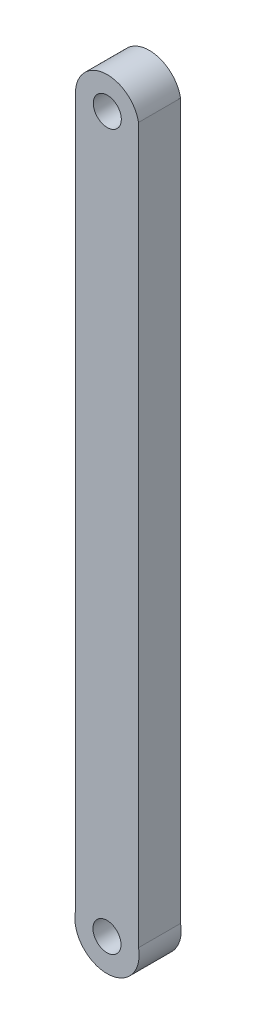
ISO-10303-21;
HEADER;
FILE_DESCRIPTION(('STEP AP214'),'2;1');
FILE_NAME('part.step','',(''),(''),'','','');
FILE_SCHEMA(('AUTOMOTIVE_DESIGN { 1 0 10303 214 1 1 1 1 }'));
ENDSEC;
DATA;
#1=APPLICATION_CONTEXT('core data for automotive mechanical design processes');
#2=APPLICATION_PROTOCOL_DEFINITION('international standard','automotive_design',2000,#1);
#3=PRODUCT_CONTEXT('',#1,'mechanical');
#4=PRODUCT('Part','Part','',(#3));
#5=PRODUCT_RELATED_PRODUCT_CATEGORY('part','',(#4));
#6=PRODUCT_DEFINITION_FORMATION('','',#4);
#7=PRODUCT_DEFINITION_CONTEXT('part definition',#1,'design');
#8=PRODUCT_DEFINITION('design','',#6,#7);
#9=PRODUCT_DEFINITION_SHAPE('','',#8);
#10=(LENGTH_UNIT() NAMED_UNIT(*) SI_UNIT(.MILLI.,.METRE.));
#11=(NAMED_UNIT(*) PLANE_ANGLE_UNIT() SI_UNIT($,.RADIAN.));
#12=(NAMED_UNIT(*) SI_UNIT($,.STERADIAN.) SOLID_ANGLE_UNIT());
#13=UNCERTAINTY_MEASURE_WITH_UNIT(LENGTH_MEASURE(1.E-05),#10,'distance_accuracy_value','');
#14=(GEOMETRIC_REPRESENTATION_CONTEXT(3) GLOBAL_UNCERTAINTY_ASSIGNED_CONTEXT((#13)) GLOBAL_UNIT_ASSIGNED_CONTEXT((#10,
#11,#12)) REPRESENTATION_CONTEXT('',''));
#15=CARTESIAN_POINT('',(0.,0.,0.));
#16=DIRECTION('',(0.,0.,1.));
#17=DIRECTION('',(1.,0.,0.));
#18=AXIS2_PLACEMENT_3D('',#15,#16,#17);
#19=CARTESIAN_POINT('',(-0.129256105217407,50.5638931416381,3.));
#20=DIRECTION('',(0.,0.,1.));
#21=DIRECTION('',(1.,0.,0.));
#22=AXIS2_PLACEMENT_3D('',#19,#20,#21);
#23=PLANE('',#22);
#24=CARTESIAN_POINT('',(-0.151950298141495,-0.436101809083264,3.));
#25=DIRECTION('',(0.,0.,1.));
#26=DIRECTION('',(1.,0.,0.));
#27=AXIS2_PLACEMENT_3D('',#24,#25,#26);
#28=CIRCLE('',#27,1.);
#29=CARTESIAN_POINT('',(0.848049701858505,-0.436101809083264,3.));
#30=VERTEX_POINT('',#29);
#31=EDGE_CURVE('E102',#30,#30,#28,.T.);
#32=ORIENTED_EDGE('',*,*,#31,.F.);
#33=EDGE_LOOP('',(#32));
#34=FACE_BOUND('',#33,.T.);
#35=CARTESIAN_POINT('',(-0.129256105217407,50.5638931416381,3.));
#36=DIRECTION('',(0.,0.,1.));
#37=DIRECTION('',(1.,0.,0.));
#38=AXIS2_PLACEMENT_3D('',#35,#36,#37);
#39=CIRCLE('',#38,2.27074389478261);
#40=CARTESIAN_POINT('',(2.09999999999999,50.9959753711309,3.));
#41=VERTEX_POINT('',#40);
#42=CARTESIAN_POINT('',(-2.40000000000001,50.5638931416381,3.));
#43=VERTEX_POINT('',#42);
#44=EDGE_CURVE('E87',#41,#43,#39,.T.);
#45=ORIENTED_EDGE('',*,*,#44,.T.);
#46=DIRECTION('',(0.,-1.,0.));
#47=VECTOR('',#46,1.);
#48=CARTESIAN_POINT('',(-2.40000000000001,50.5638931416381,3.));
#49=LINE('',#48,#47);
#50=CARTESIAN_POINT('',(-2.40000000000001,0.0196804538000522,3.));
#51=VERTEX_POINT('',#50);
#52=EDGE_CURVE('E82',#43,#51,#49,.T.);
#53=ORIENTED_EDGE('',*,*,#52,.T.);
#54=CARTESIAN_POINT('',(-0.151950298141495,-0.436101809083264,3.));
#55=DIRECTION('',(0.,0.,1.));
#56=DIRECTION('',(1.,0.,0.));
#57=AXIS2_PLACEMENT_3D('',#54,#55,#56);
#58=CIRCLE('',#57,2.29378833661373);
#59=CARTESIAN_POINT('',(2.09999999999999,0.,3.));
#60=VERTEX_POINT('',#59);
#61=EDGE_CURVE('E85',#51,#60,#58,.T.);
#62=ORIENTED_EDGE('',*,*,#61,.T.);
#63=DIRECTION('',(0.,1.,0.));
#64=VECTOR('',#63,1.);
#65=CARTESIAN_POINT('',(2.09999999999999,0.,3.));
#66=LINE('',#65,#64);
#67=EDGE_CURVE('E52',#60,#41,#66,.T.);
#68=ORIENTED_EDGE('',*,*,#67,.T.);
#69=EDGE_LOOP('',(#45,#53,#62,#68));
#70=FACE_BOUND('',#69,.T.);
#71=CARTESIAN_POINT('',(-0.129256105217407,50.5638931416381,3.));
#72=DIRECTION('',(0.,0.,1.));
#73=DIRECTION('',(1.,0.,0.));
#74=AXIS2_PLACEMENT_3D('',#71,#72,#73);
#75=CIRCLE('',#74,1.);
#76=CARTESIAN_POINT('',(0.870743894782594,50.5638931416381,3.));
#77=VERTEX_POINT('',#76);
#78=EDGE_CURVE('E117',#77,#77,#75,.T.);
#79=ORIENTED_EDGE('',*,*,#78,.F.);
#80=EDGE_LOOP('',(#79));
#81=FACE_BOUND('',#80,.T.);
#82=ADVANCED_FACE('F35',(#34,#70,#81),#23,.T.);
#83=CARTESIAN_POINT('',(-0.129256105217407,50.5638931416381,0.));
#84=DIRECTION('',(0.,0.,1.));
#85=DIRECTION('',(1.,0.,0.));
#86=AXIS2_PLACEMENT_3D('',#83,#84,#85);
#87=PLANE('',#86);
#88=CARTESIAN_POINT('',(-0.129256105217407,50.5638931416381,0.));
#89=DIRECTION('',(0.,0.,1.));
#90=DIRECTION('',(1.,0.,0.));
#91=AXIS2_PLACEMENT_3D('',#88,#89,#90);
#92=CIRCLE('',#91,2.27074389478261);
#93=CARTESIAN_POINT('',(2.09999999999999,50.9959753711309,0.));
#94=VERTEX_POINT('',#93);
#95=CARTESIAN_POINT('',(-2.40000000000001,50.5638931416381,0.));
#96=VERTEX_POINT('',#95);
#97=EDGE_CURVE('E99',#94,#96,#92,.T.);
#98=ORIENTED_EDGE('',*,*,#97,.F.);
#99=DIRECTION('',(0.,1.,0.));
#100=VECTOR('',#99,1.);
#101=CARTESIAN_POINT('',(2.09999999999999,0.,0.));
#102=LINE('',#101,#100);
#103=CARTESIAN_POINT('',(2.09999999999999,0.,0.));
#104=VERTEX_POINT('',#103);
#105=EDGE_CURVE('E75',#104,#94,#102,.T.);
#106=ORIENTED_EDGE('',*,*,#105,.F.);
#107=CARTESIAN_POINT('',(-0.151950298141495,-0.436101809083264,0.));
#108=DIRECTION('',(0.,0.,1.));
#109=DIRECTION('',(1.,0.,0.));
#110=AXIS2_PLACEMENT_3D('',#107,#108,#109);
#111=CIRCLE('',#110,2.29378833661373);
#112=CARTESIAN_POINT('',(-2.40000000000001,0.0196804538000522,0.));
#113=VERTEX_POINT('',#112);
#114=EDGE_CURVE('E69',#113,#104,#111,.T.);
#115=ORIENTED_EDGE('',*,*,#114,.F.);
#116=DIRECTION('',(0.,-1.,0.));
#117=VECTOR('',#116,1.);
#118=CARTESIAN_POINT('',(-2.40000000000001,50.5638931416381,0.));
#119=LINE('',#118,#117);
#120=EDGE_CURVE('E91',#96,#113,#119,.T.);
#121=ORIENTED_EDGE('',*,*,#120,.F.);
#122=EDGE_LOOP('',(#98,#106,#115,#121));
#123=FACE_BOUND('',#122,.T.);
#124=CARTESIAN_POINT('',(-0.151950298141495,-0.436101809083264,0.));
#125=DIRECTION('',(0.,0.,1.));
#126=DIRECTION('',(1.,0.,0.));
#127=AXIS2_PLACEMENT_3D('',#124,#125,#126);
#128=CIRCLE('',#127,1.);
#129=CARTESIAN_POINT('',(0.848049701858505,-0.436101809083264,0.));
#130=VERTEX_POINT('',#129);
#131=EDGE_CURVE('E114',#130,#130,#128,.T.);
#132=ORIENTED_EDGE('',*,*,#131,.T.);
#133=EDGE_LOOP('',(#132));
#134=FACE_BOUND('',#133,.T.);
#135=CARTESIAN_POINT('',(-0.129256105217407,50.5638931416381,0.));
#136=DIRECTION('',(0.,0.,1.));
#137=DIRECTION('',(1.,0.,0.));
#138=AXIS2_PLACEMENT_3D('',#135,#136,#137);
#139=CIRCLE('',#138,1.);
#140=CARTESIAN_POINT('',(0.870743894782594,50.5638931416381,0.));
#141=VERTEX_POINT('',#140);
#142=EDGE_CURVE('E120',#141,#141,#139,.T.);
#143=ORIENTED_EDGE('',*,*,#142,.T.);
#144=EDGE_LOOP('',(#143));
#145=FACE_BOUND('',#144,.T.);
#146=ADVANCED_FACE('F110',(#123,#134,#145),#87,.F.);
#147=CARTESIAN_POINT('',(-0.129256105217407,50.5638931416381,3.));
#148=DIRECTION('',(0.,0.,-1.));
#149=DIRECTION('',(-1.,0.,0.));
#150=AXIS2_PLACEMENT_3D('',#147,#148,#149);
#151=CYLINDRICAL_SURFACE('',#150,2.27074389478261);
#152=ORIENTED_EDGE('',*,*,#97,.T.);
#153=DIRECTION('',(0.,0.,-1.));
#154=VECTOR('',#153,1.);
#155=CARTESIAN_POINT('',(-2.40000000000001,50.5638931416381,3.));
#156=LINE('',#155,#154);
#157=EDGE_CURVE('E11',#43,#96,#156,.T.);
#158=ORIENTED_EDGE('',*,*,#157,.F.);
#159=ORIENTED_EDGE('',*,*,#44,.F.);
#160=DIRECTION('',(0.,0.,-1.));
#161=VECTOR('',#160,1.);
#162=CARTESIAN_POINT('',(2.09999999999999,50.9959753711309,3.));
#163=LINE('',#162,#161);
#164=EDGE_CURVE('E95',#41,#94,#163,.T.);
#165=ORIENTED_EDGE('',*,*,#164,.T.);
#166=EDGE_LOOP('',(#152,#158,#159,#165));
#167=FACE_BOUND('',#166,.T.);
#168=ADVANCED_FACE('F37',(#167),#151,.T.);
#169=CARTESIAN_POINT('',(-2.40000000000001,50.5638931416381,3.));
#170=DIRECTION('',(1.,0.,0.));
#171=DIRECTION('',(0.,0.,-1.));
#172=AXIS2_PLACEMENT_3D('',#169,#170,#171);
#173=PLANE('',#172);
#174=ORIENTED_EDGE('',*,*,#120,.T.);
#175=DIRECTION('',(0.,0.,-1.));
#176=VECTOR('',#175,1.);
#177=CARTESIAN_POINT('',(-2.40000000000001,0.0196804538000522,3.));
#178=LINE('',#177,#176);
#179=EDGE_CURVE('E44',#51,#113,#178,.T.);
#180=ORIENTED_EDGE('',*,*,#179,.F.);
#181=ORIENTED_EDGE('',*,*,#52,.F.);
#182=ORIENTED_EDGE('',*,*,#157,.T.);
#183=EDGE_LOOP('',(#174,#180,#181,#182));
#184=FACE_BOUND('',#183,.T.);
#185=ADVANCED_FACE('F90',(#184),#173,.F.);
#186=CARTESIAN_POINT('',(-0.151950298141495,-0.436101809083264,3.));
#187=DIRECTION('',(0.,0.,-1.));
#188=DIRECTION('',(-1.,0.,0.));
#189=AXIS2_PLACEMENT_3D('',#186,#187,#188);
#190=CYLINDRICAL_SURFACE('',#189,2.29378833661373);
#191=ORIENTED_EDGE('',*,*,#114,.T.);
#192=DIRECTION('',(0.,0.,-1.));
#193=VECTOR('',#192,1.);
#194=CARTESIAN_POINT('',(2.09999999999999,0.,3.));
#195=LINE('',#194,#193);
#196=EDGE_CURVE('E92',#60,#104,#195,.T.);
#197=ORIENTED_EDGE('',*,*,#196,.F.);
#198=ORIENTED_EDGE('',*,*,#61,.F.);
#199=ORIENTED_EDGE('',*,*,#179,.T.);
#200=EDGE_LOOP('',(#191,#197,#198,#199));
#201=FACE_BOUND('',#200,.T.);
#202=ADVANCED_FACE('F93',(#201),#190,.T.);
#203=CARTESIAN_POINT('',(2.09999999999999,0.,3.));
#204=DIRECTION('',(-1.,0.,0.));
#205=DIRECTION('',(0.,0.,1.));
#206=AXIS2_PLACEMENT_3D('',#203,#204,#205);
#207=PLANE('',#206);
#208=ORIENTED_EDGE('',*,*,#105,.T.);
#209=ORIENTED_EDGE('',*,*,#164,.F.);
#210=ORIENTED_EDGE('',*,*,#67,.F.);
#211=ORIENTED_EDGE('',*,*,#196,.T.);
#212=EDGE_LOOP('',(#208,#209,#210,#211));
#213=FACE_BOUND('',#212,.T.);
#214=ADVANCED_FACE('F107',(#213),#207,.F.);
#215=CARTESIAN_POINT('',(-0.151950298141495,-0.436101809083264,3.));
#216=DIRECTION('',(0.,0.,-1.));
#217=DIRECTION('',(-1.,0.,0.));
#218=AXIS2_PLACEMENT_3D('',#215,#216,#217);
#219=CYLINDRICAL_SURFACE('',#218,1.);
#220=ORIENTED_EDGE('',*,*,#31,.T.);
#221=EDGE_LOOP('',(#220));
#222=FACE_BOUND('',#221,.T.);
#223=ORIENTED_EDGE('',*,*,#131,.F.);
#224=EDGE_LOOP('',(#223));
#225=FACE_BOUND('',#224,.T.);
#226=ADVANCED_FACE('F137',(#222,#225),#219,.F.);
#227=CARTESIAN_POINT('',(-0.129256105217407,50.5638931416381,3.));
#228=DIRECTION('',(0.,0.,-1.));
#229=DIRECTION('',(-1.,0.,0.));
#230=AXIS2_PLACEMENT_3D('',#227,#228,#229);
#231=CYLINDRICAL_SURFACE('',#230,1.);
#232=ORIENTED_EDGE('',*,*,#78,.T.);
#233=EDGE_LOOP('',(#232));
#234=FACE_BOUND('',#233,.T.);
#235=ORIENTED_EDGE('',*,*,#142,.F.);
#236=EDGE_LOOP('',(#235));
#237=FACE_BOUND('',#236,.T.);
#238=ADVANCED_FACE('F126',(#234,#237),#231,.F.);
#239=CLOSED_SHELL('',(#82,#146,#168,#185,#202,#214,#226,#238));
#240=MANIFOLD_SOLID_BREP('B2',#239);
#241=ADVANCED_BREP_SHAPE_REPRESENTATION('',(#18,#240),#14);
#242=SHAPE_DEFINITION_REPRESENTATION(#9,#241);
ENDSEC;
END-ISO-10303-21;
